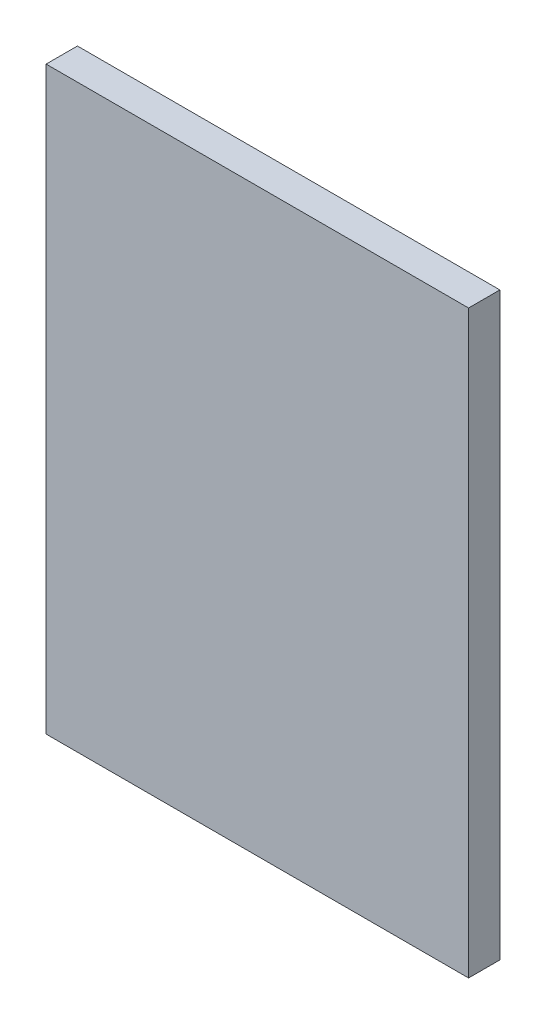
ISO-10303-21;
HEADER;
FILE_DESCRIPTION(('STEP AP214'),'2;1');
FILE_NAME('part.step','',(''),(''),'','','');
FILE_SCHEMA(('AUTOMOTIVE_DESIGN { 1 0 10303 214 1 1 1 1 }'));
ENDSEC;
DATA;
#1=APPLICATION_CONTEXT('core data for automotive mechanical design processes');
#2=APPLICATION_PROTOCOL_DEFINITION('international standard','automotive_design',2000,#1);
#3=PRODUCT_CONTEXT('',#1,'mechanical');
#4=PRODUCT('Part','Part','',(#3));
#5=PRODUCT_RELATED_PRODUCT_CATEGORY('part','',(#4));
#6=PRODUCT_DEFINITION_FORMATION('','',#4);
#7=PRODUCT_DEFINITION_CONTEXT('part definition',#1,'design');
#8=PRODUCT_DEFINITION('design','',#6,#7);
#9=PRODUCT_DEFINITION_SHAPE('','',#8);
#10=(LENGTH_UNIT() NAMED_UNIT(*) SI_UNIT(.MILLI.,.METRE.));
#11=(NAMED_UNIT(*) PLANE_ANGLE_UNIT() SI_UNIT($,.RADIAN.));
#12=(NAMED_UNIT(*) SI_UNIT($,.STERADIAN.) SOLID_ANGLE_UNIT());
#13=UNCERTAINTY_MEASURE_WITH_UNIT(LENGTH_MEASURE(1.E-05),#10,'distance_accuracy_value','');
#14=(GEOMETRIC_REPRESENTATION_CONTEXT(3) GLOBAL_UNCERTAINTY_ASSIGNED_CONTEXT((#13)) GLOBAL_UNIT_ASSIGNED_CONTEXT((#10,
#11,#12)) REPRESENTATION_CONTEXT('',''));
#15=CARTESIAN_POINT('',(0.,0.,0.));
#16=DIRECTION('',(0.,0.,1.));
#17=DIRECTION('',(1.,0.,0.));
#18=AXIS2_PLACEMENT_3D('',#15,#16,#17);
#19=CARTESIAN_POINT('',(-0.682755,0.702945,1.));
#20=DIRECTION('',(0.,0.,1.));
#21=DIRECTION('',(1.,0.,0.));
#22=AXIS2_PLACEMENT_3D('',#19,#20,#21);
#23=PLANE('',#22);
#24=DIRECTION('',(1.,0.,0.));
#25=VECTOR('',#24,1.);
#26=CARTESIAN_POINT('',(-7.42925,-8.56361,1.));
#27=LINE('',#26,#25);
#28=CARTESIAN_POINT('',(-7.42925,-8.56361,1.));
#29=VERTEX_POINT('',#28);
#30=CARTESIAN_POINT('',(6.06374,-8.56361,1.));
#31=VERTEX_POINT('',#30);
#32=EDGE_CURVE('E79',#29,#31,#27,.T.);
#33=ORIENTED_EDGE('',*,*,#32,.T.);
#34=DIRECTION('',(0.,1.,0.));
#35=VECTOR('',#34,1.);
#36=CARTESIAN_POINT('',(6.06374,-8.56361,1.));
#37=LINE('',#36,#35);
#38=CARTESIAN_POINT('',(6.06374,9.9695,1.));
#39=VERTEX_POINT('',#38);
#40=EDGE_CURVE('E85',#31,#39,#37,.T.);
#41=ORIENTED_EDGE('',*,*,#40,.T.);
#42=DIRECTION('',(-1.,0.,0.));
#43=VECTOR('',#42,1.);
#44=CARTESIAN_POINT('',(6.06374,9.9695,1.));
#45=LINE('',#44,#43);
#46=CARTESIAN_POINT('',(-7.42925,9.9695,1.));
#47=VERTEX_POINT('',#46);
#48=EDGE_CURVE('E102',#39,#47,#45,.T.);
#49=ORIENTED_EDGE('',*,*,#48,.T.);
#50=DIRECTION('',(0.,-1.,0.));
#51=VECTOR('',#50,1.);
#52=CARTESIAN_POINT('',(-7.42925,9.9695,1.));
#53=LINE('',#52,#51);
#54=EDGE_CURVE('E11',#47,#29,#53,.T.);
#55=ORIENTED_EDGE('',*,*,#54,.T.);
#56=EDGE_LOOP('',(#33,#41,#49,#55));
#57=FACE_BOUND('',#56,.T.);
#58=ADVANCED_FACE('F16',(#57),#23,.T.);
#59=CARTESIAN_POINT('',(-0.682755,0.702945,0.));
#60=DIRECTION('',(0.,0.,1.));
#61=DIRECTION('',(1.,0.,0.));
#62=AXIS2_PLACEMENT_3D('',#59,#60,#61);
#63=PLANE('',#62);
#64=DIRECTION('',(1.,0.,0.));
#65=VECTOR('',#64,1.);
#66=CARTESIAN_POINT('',(-7.42925,-8.56361,0.));
#67=LINE('',#66,#65);
#68=CARTESIAN_POINT('',(-7.42925,-8.56361,0.));
#69=VERTEX_POINT('',#68);
#70=CARTESIAN_POINT('',(6.06374,-8.56361,0.));
#71=VERTEX_POINT('',#70);
#72=EDGE_CURVE('E71',#69,#71,#67,.T.);
#73=ORIENTED_EDGE('',*,*,#72,.F.);
#74=DIRECTION('',(0.,-1.,0.));
#75=VECTOR('',#74,1.);
#76=CARTESIAN_POINT('',(-7.42925,9.9695,0.));
#77=LINE('',#76,#75);
#78=CARTESIAN_POINT('',(-7.42925,9.9695,0.));
#79=VERTEX_POINT('',#78);
#80=EDGE_CURVE('E27',#79,#69,#77,.T.);
#81=ORIENTED_EDGE('',*,*,#80,.F.);
#82=DIRECTION('',(-1.,0.,0.));
#83=VECTOR('',#82,1.);
#84=CARTESIAN_POINT('',(6.06374,9.9695,0.));
#85=LINE('',#84,#83);
#86=CARTESIAN_POINT('',(6.06374,9.9695,0.));
#87=VERTEX_POINT('',#86);
#88=EDGE_CURVE('E20',#87,#79,#85,.T.);
#89=ORIENTED_EDGE('',*,*,#88,.F.);
#90=DIRECTION('',(0.,1.,0.));
#91=VECTOR('',#90,1.);
#92=CARTESIAN_POINT('',(6.06374,-8.56361,0.));
#93=LINE('',#92,#91);
#94=EDGE_CURVE('E67',#71,#87,#93,.T.);
#95=ORIENTED_EDGE('',*,*,#94,.F.);
#96=EDGE_LOOP('',(#73,#81,#89,#95));
#97=FACE_BOUND('',#96,.T.);
#98=ADVANCED_FACE('F69',(#97),#63,.F.);
#99=CARTESIAN_POINT('',(-7.42925,9.9695,0.));
#100=DIRECTION('',(1.,0.,0.));
#101=DIRECTION('',(0.,1.,0.));
#102=AXIS2_PLACEMENT_3D('',#99,#100,#101);
#103=PLANE('',#102);
#104=DIRECTION('',(0.,0.,1.));
#105=VECTOR('',#104,1.);
#106=CARTESIAN_POINT('',(-7.42925,9.9695,0.));
#107=LINE('',#106,#105);
#108=EDGE_CURVE('E104',#79,#47,#107,.T.);
#109=ORIENTED_EDGE('',*,*,#108,.F.);
#110=ORIENTED_EDGE('',*,*,#80,.T.);
#111=DIRECTION('',(0.,0.,1.));
#112=VECTOR('',#111,1.);
#113=CARTESIAN_POINT('',(-7.42925,-8.56361,0.));
#114=LINE('',#113,#112);
#115=EDGE_CURVE('E92',#69,#29,#114,.T.);
#116=ORIENTED_EDGE('',*,*,#115,.T.);
#117=ORIENTED_EDGE('',*,*,#54,.F.);
#118=EDGE_LOOP('',(#109,#110,#116,#117));
#119=FACE_BOUND('',#118,.T.);
#120=ADVANCED_FACE('F118',(#119),#103,.F.);
#121=CARTESIAN_POINT('',(6.06374,9.9695,0.));
#122=DIRECTION('',(0.,-1.,0.));
#123=DIRECTION('',(0.,0.,-1.));
#124=AXIS2_PLACEMENT_3D('',#121,#122,#123);
#125=PLANE('',#124);
#126=DIRECTION('',(0.,0.,1.));
#127=VECTOR('',#126,1.);
#128=CARTESIAN_POINT('',(6.06374,9.9695,0.));
#129=LINE('',#128,#127);
#130=EDGE_CURVE('E78',#87,#39,#129,.T.);
#131=ORIENTED_EDGE('',*,*,#130,.F.);
#132=ORIENTED_EDGE('',*,*,#88,.T.);
#133=ORIENTED_EDGE('',*,*,#108,.T.);
#134=ORIENTED_EDGE('',*,*,#48,.F.);
#135=EDGE_LOOP('',(#131,#132,#133,#134));
#136=FACE_BOUND('',#135,.T.);
#137=ADVANCED_FACE('F18',(#136),#125,.F.);
#138=CARTESIAN_POINT('',(6.06374,-8.56361,0.));
#139=DIRECTION('',(-1.,0.,0.));
#140=DIRECTION('',(0.,0.,1.));
#141=AXIS2_PLACEMENT_3D('',#138,#139,#140);
#142=PLANE('',#141);
#143=DIRECTION('',(0.,0.,1.));
#144=VECTOR('',#143,1.);
#145=CARTESIAN_POINT('',(6.06374,-8.56361,0.));
#146=LINE('',#145,#144);
#147=EDGE_CURVE('E82',#71,#31,#146,.T.);
#148=ORIENTED_EDGE('',*,*,#147,.F.);
#149=ORIENTED_EDGE('',*,*,#94,.T.);
#150=ORIENTED_EDGE('',*,*,#130,.T.);
#151=ORIENTED_EDGE('',*,*,#40,.F.);
#152=EDGE_LOOP('',(#148,#149,#150,#151));
#153=FACE_BOUND('',#152,.T.);
#154=ADVANCED_FACE('F83',(#153),#142,.F.);
#155=CARTESIAN_POINT('',(-7.42925,-8.56361,0.));
#156=DIRECTION('',(0.,1.,0.));
#157=DIRECTION('',(1.,0.,0.));
#158=AXIS2_PLACEMENT_3D('',#155,#156,#157);
#159=PLANE('',#158);
#160=ORIENTED_EDGE('',*,*,#115,.F.);
#161=ORIENTED_EDGE('',*,*,#72,.T.);
#162=ORIENTED_EDGE('',*,*,#147,.T.);
#163=ORIENTED_EDGE('',*,*,#32,.F.);
#164=EDGE_LOOP('',(#160,#161,#162,#163));
#165=FACE_BOUND('',#164,.T.);
#166=ADVANCED_FACE('F91',(#165),#159,.F.);
#167=CLOSED_SHELL('',(#58,#98,#120,#137,#154,#166));
#168=MANIFOLD_SOLID_BREP('B1',#167);
#169=ADVANCED_BREP_SHAPE_REPRESENTATION('',(#18,#168),#14);
#170=SHAPE_DEFINITION_REPRESENTATION(#9,#169);
ENDSEC;
END-ISO-10303-21;
